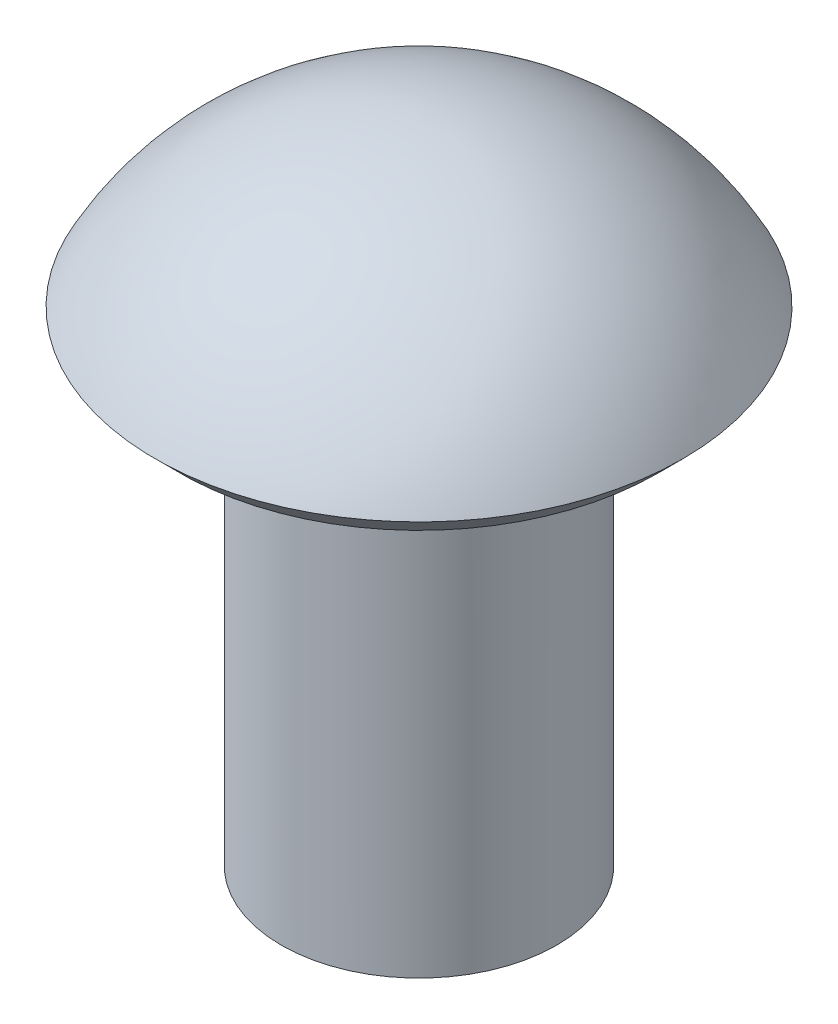
ISO-10303-21;
HEADER;
FILE_DESCRIPTION(('STEP AP214'),'2;1');
FILE_NAME('part.step','',(''),(''),'','','');
FILE_SCHEMA(('AUTOMOTIVE_DESIGN { 1 0 10303 214 1 1 1 1 }'));
ENDSEC;
DATA;
#1=APPLICATION_CONTEXT('core data for automotive mechanical design processes');
#2=APPLICATION_PROTOCOL_DEFINITION('international standard','automotive_design',2000,#1);
#3=PRODUCT_CONTEXT('',#1,'mechanical');
#4=PRODUCT('Part','Part','',(#3));
#5=PRODUCT_RELATED_PRODUCT_CATEGORY('part','',(#4));
#6=PRODUCT_DEFINITION_FORMATION('','',#4);
#7=PRODUCT_DEFINITION_CONTEXT('part definition',#1,'design');
#8=PRODUCT_DEFINITION('design','',#6,#7);
#9=PRODUCT_DEFINITION_SHAPE('','',#8);
#10=(LENGTH_UNIT() NAMED_UNIT(*) SI_UNIT(.MILLI.,.METRE.));
#11=(NAMED_UNIT(*) PLANE_ANGLE_UNIT() SI_UNIT($,.RADIAN.));
#12=(NAMED_UNIT(*) SI_UNIT($,.STERADIAN.) SOLID_ANGLE_UNIT());
#13=UNCERTAINTY_MEASURE_WITH_UNIT(LENGTH_MEASURE(1.E-05),#10,'distance_accuracy_value','');
#14=(GEOMETRIC_REPRESENTATION_CONTEXT(3) GLOBAL_UNCERTAINTY_ASSIGNED_CONTEXT((#13)) GLOBAL_UNIT_ASSIGNED_CONTEXT((#10,
#11,#12)) REPRESENTATION_CONTEXT('',''));
#15=CARTESIAN_POINT('',(0.,0.,0.));
#16=DIRECTION('',(0.,0.,1.));
#17=DIRECTION('',(1.,0.,0.));
#18=AXIS2_PLACEMENT_3D('',#15,#16,#17);
#19=CARTESIAN_POINT('',(0.,5.,0.));
#20=DIRECTION('',(0.,-1.,0.));
#21=DIRECTION('',(0.,0.,-1.));
#22=AXIS2_PLACEMENT_3D('',#19,#20,#21);
#23=CYLINDRICAL_SURFACE('',#22,1.5);
#24=CARTESIAN_POINT('',(0.,4.6,0.));
#25=DIRECTION('',(0.,-1.,0.));
#26=DIRECTION('',(1.,0.,0.));
#27=AXIS2_PLACEMENT_3D('',#24,#25,#26);
#28=CIRCLE('',#27,1.5);
#29=CARTESIAN_POINT('',(1.5,4.6,0.));
#30=VERTEX_POINT('',#29);
#31=EDGE_CURVE('E51',#30,#30,#28,.T.);
#32=ORIENTED_EDGE('',*,*,#31,.T.);
#33=EDGE_LOOP('',(#32));
#34=FACE_BOUND('',#33,.T.);
#35=CARTESIAN_POINT('',(0.,0.,0.));
#36=DIRECTION('',(0.,1.,0.));
#37=DIRECTION('',(0.,0.,1.));
#38=AXIS2_PLACEMENT_3D('',#35,#36,#37);
#39=CIRCLE('',#38,1.5);
#40=CARTESIAN_POINT('',(0.,0.,1.5));
#41=VERTEX_POINT('',#40);
#42=EDGE_CURVE('E60',#41,#41,#39,.T.);
#43=ORIENTED_EDGE('',*,*,#42,.T.);
#44=EDGE_LOOP('',(#43));
#45=FACE_BOUND('',#44,.T.);
#46=ADVANCED_FACE('F39',(#34,#45),#23,.T.);
#47=CARTESIAN_POINT('',(0.,0.,0.));
#48=DIRECTION('',(0.,1.,0.));
#49=DIRECTION('',(0.,0.,1.));
#50=AXIS2_PLACEMENT_3D('',#47,#48,#49);
#51=PLANE('',#50);
#52=ORIENTED_EDGE('',*,*,#42,.F.);
#53=EDGE_LOOP('',(#52));
#54=FACE_BOUND('',#53,.T.);
#55=ADVANCED_FACE('F65',(#54),#51,.F.);
#56=CARTESIAN_POINT('',(0.,5.,0.));
#57=DIRECTION('',(0.,-1.,0.));
#58=DIRECTION('',(1.,0.,0.));
#59=AXIS2_PLACEMENT_3D('',#56,#57,#58);
#60=PLANE('',#59);
#61=CARTESIAN_POINT('',(0.,5.,0.));
#62=DIRECTION('',(0.,-1.,0.));
#63=DIRECTION('',(1.,0.,0.));
#64=AXIS2_PLACEMENT_3D('',#61,#62,#63);
#65=CIRCLE('',#64,2.59999999999999);
#66=CARTESIAN_POINT('',(2.59999999999999,5.,0.));
#67=VERTEX_POINT('',#66);
#68=EDGE_CURVE('E10',#67,#67,#65,.T.);
#69=ORIENTED_EDGE('',*,*,#68,.T.);
#70=EDGE_LOOP('',(#69));
#71=FACE_BOUND('',#70,.T.);
#72=CARTESIAN_POINT('',(0.,5.,0.));
#73=DIRECTION('',(0.,-1.,0.));
#74=DIRECTION('',(1.,0.,0.));
#75=AXIS2_PLACEMENT_3D('',#72,#73,#74);
#76=CIRCLE('',#75,1.9);
#77=CARTESIAN_POINT('',(1.9,5.,0.));
#78=VERTEX_POINT('',#77);
#79=EDGE_CURVE('E55',#78,#78,#76,.F.);
#80=ORIENTED_EDGE('',*,*,#79,.T.);
#81=EDGE_LOOP('',(#80));
#82=FACE_BOUND('',#81,.T.);
#83=ADVANCED_FACE('F67',(#71,#82),#60,.T.);
#84=CARTESIAN_POINT('',(0.,3.75,0.));
#85=DIRECTION('',(0.,1.,0.));
#86=DIRECTION('',(-1.,0.,0.));
#87=AXIS2_PLACEMENT_3D('',#84,#85,#86);
#88=SPHERICAL_SURFACE('',#87,3.25);
#89=CARTESIAN_POINT('',(0.,5.27173052512137,0.));
#90=DIRECTION('',(0.,-1.,0.));
#91=DIRECTION('',(1.,0.,0.));
#92=AXIS2_PLACEMENT_3D('',#89,#90,#91);
#93=CIRCLE('',#92,2.87173052512137);
#94=CARTESIAN_POINT('',(2.87173052512137,5.27173052512137,0.));
#95=VERTEX_POINT('',#94);
#96=EDGE_CURVE('E47',#95,#95,#93,.F.);
#97=ORIENTED_EDGE('',*,*,#96,.T.);
#98=EDGE_LOOP('',(#97));
#99=FACE_BOUND('',#98,.T.);
#100=ADVANCED_FACE('F73',(#99),#88,.T.);
#101=CARTESIAN_POINT('',(0.,4.6,0.));
#102=DIRECTION('',(0.,-1.,0.));
#103=DIRECTION('',(1.,0.,0.));
#104=AXIS2_PLACEMENT_3D('',#101,#102,#103);
#105=TOROIDAL_SURFACE('',#104,1.9,0.4);
#106=ORIENTED_EDGE('',*,*,#31,.F.);
#107=EDGE_LOOP('',(#106));
#108=FACE_BOUND('',#107,.T.);
#109=ORIENTED_EDGE('',*,*,#79,.F.);
#110=EDGE_LOOP('',(#109));
#111=FACE_BOUND('',#110,.T.);
#112=ADVANCED_FACE('F78',(#108,#111),#105,.F.);
#113=CARTESIAN_POINT('',(0.,5.27173052512137,0.));
#114=DIRECTION('',(0.,1.,0.));
#115=DIRECTION('',(-1.,0.,0.));
#116=AXIS2_PLACEMENT_3D('',#113,#114,#115);
#117=CONICAL_SURFACE('',#116,2.87173052512137,0.785398163397452);
#118=ORIENTED_EDGE('',*,*,#68,.F.);
#119=EDGE_LOOP('',(#118));
#120=FACE_BOUND('',#119,.T.);
#121=ORIENTED_EDGE('',*,*,#96,.F.);
#122=EDGE_LOOP('',(#121));
#123=FACE_BOUND('',#122,.T.);
#124=ADVANCED_FACE('F42',(#120,#123),#117,.T.);
#125=CLOSED_SHELL('',(#46,#55,#83,#100,#112,#124));
#126=MANIFOLD_SOLID_BREP('B2',#125);
#127=ADVANCED_BREP_SHAPE_REPRESENTATION('',(#18,#126),#14);
#128=SHAPE_DEFINITION_REPRESENTATION(#9,#127);
ENDSEC;
END-ISO-10303-21;
